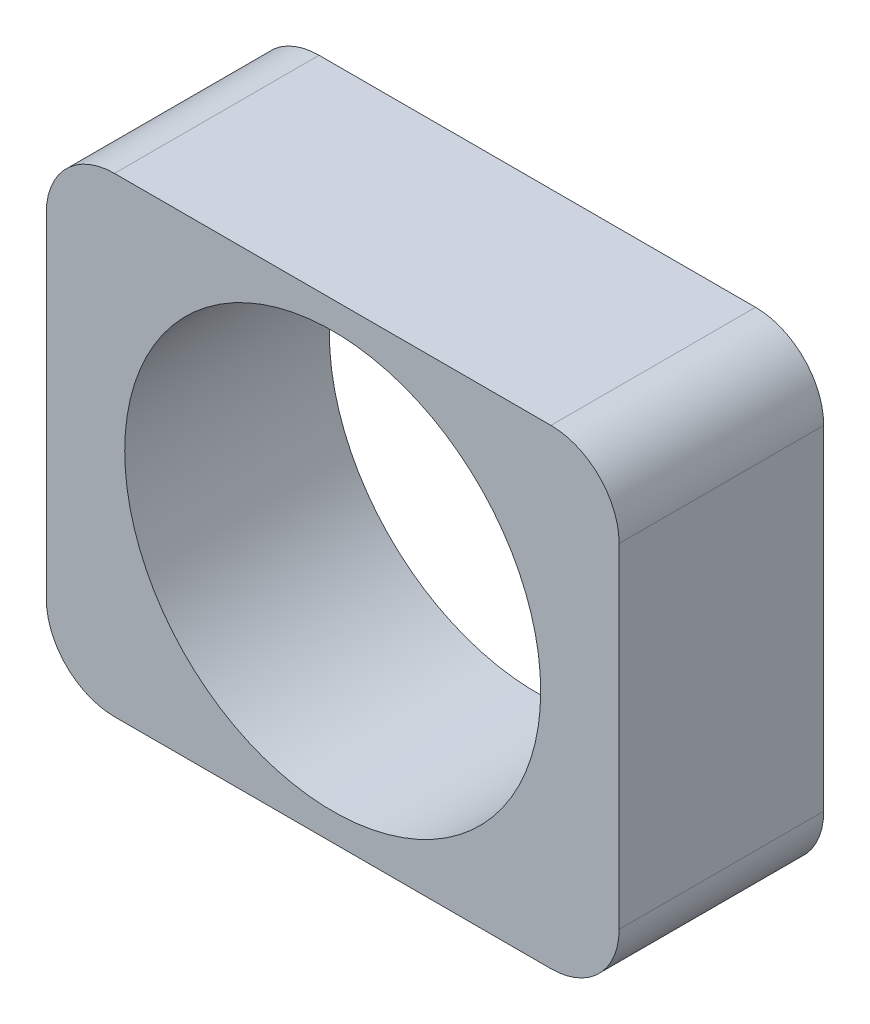
ISO-10303-21;
HEADER;
FILE_DESCRIPTION(('STEP AP214'),'2;1');
FILE_NAME('part.step','',(''),(''),'','','');
FILE_SCHEMA(('AUTOMOTIVE_DESIGN { 1 0 10303 214 1 1 1 1 }'));
ENDSEC;
DATA;
#1=APPLICATION_CONTEXT('core data for automotive mechanical design processes');
#2=APPLICATION_PROTOCOL_DEFINITION('international standard','automotive_design',2000,#1);
#3=PRODUCT_CONTEXT('',#1,'mechanical');
#4=PRODUCT('Part','Part','',(#3));
#5=PRODUCT_RELATED_PRODUCT_CATEGORY('part','',(#4));
#6=PRODUCT_DEFINITION_FORMATION('','',#4);
#7=PRODUCT_DEFINITION_CONTEXT('part definition',#1,'design');
#8=PRODUCT_DEFINITION('design','',#6,#7);
#9=PRODUCT_DEFINITION_SHAPE('','',#8);
#10=(LENGTH_UNIT() NAMED_UNIT(*) SI_UNIT(.MILLI.,.METRE.));
#11=(NAMED_UNIT(*) PLANE_ANGLE_UNIT() SI_UNIT($,.RADIAN.));
#12=(NAMED_UNIT(*) SI_UNIT($,.STERADIAN.) SOLID_ANGLE_UNIT());
#13=UNCERTAINTY_MEASURE_WITH_UNIT(LENGTH_MEASURE(1.E-05),#10,'distance_accuracy_value','');
#14=(GEOMETRIC_REPRESENTATION_CONTEXT(3) GLOBAL_UNCERTAINTY_ASSIGNED_CONTEXT((#13)) GLOBAL_UNIT_ASSIGNED_CONTEXT((#10,
#11,#12)) REPRESENTATION_CONTEXT('',''));
#15=CARTESIAN_POINT('',(0.,0.,0.));
#16=DIRECTION('',(0.,0.,1.));
#17=DIRECTION('',(1.,0.,0.));
#18=AXIS2_PLACEMENT_3D('',#15,#16,#17);
#19=CARTESIAN_POINT('',(8.4,6.9,6.));
#20=DIRECTION('',(-1.,0.,0.));
#21=DIRECTION('',(0.,-1.,0.));
#22=AXIS2_PLACEMENT_3D('',#19,#20,#21);
#23=PLANE('',#22);
#24=DIRECTION('',(0.,1.,0.));
#25=VECTOR('',#24,1.);
#26=CARTESIAN_POINT('',(8.4,6.9,6.));
#27=LINE('',#26,#25);
#28=CARTESIAN_POINT('',(8.4,-4.9,6.));
#29=VERTEX_POINT('',#28);
#30=CARTESIAN_POINT('',(8.4,4.9,6.));
#31=VERTEX_POINT('',#30);
#32=EDGE_CURVE('E119',#29,#31,#27,.T.);
#33=ORIENTED_EDGE('',*,*,#32,.F.);
#34=DIRECTION('',(0.,0.,-1.));
#35=VECTOR('',#34,1.);
#36=CARTESIAN_POINT('',(8.4,-4.9,6.));
#37=LINE('',#36,#35);
#38=CARTESIAN_POINT('',(8.4,-4.9,0.));
#39=VERTEX_POINT('',#38);
#40=EDGE_CURVE('E104',#29,#39,#37,.T.);
#41=ORIENTED_EDGE('',*,*,#40,.T.);
#42=DIRECTION('',(0.,1.,0.));
#43=VECTOR('',#42,1.);
#44=CARTESIAN_POINT('',(8.4,6.9,0.));
#45=LINE('',#44,#43);
#46=CARTESIAN_POINT('',(8.4,4.9,0.));
#47=VERTEX_POINT('',#46);
#48=EDGE_CURVE('E116',#39,#47,#45,.T.);
#49=ORIENTED_EDGE('',*,*,#48,.T.);
#50=DIRECTION('',(0.,0.,-1.));
#51=VECTOR('',#50,1.);
#52=CARTESIAN_POINT('',(8.4,4.9,6.));
#53=LINE('',#52,#51);
#54=EDGE_CURVE('E121',#47,#31,#53,.F.);
#55=ORIENTED_EDGE('',*,*,#54,.T.);
#56=EDGE_LOOP('',(#33,#41,#49,#55));
#57=FACE_BOUND('',#56,.T.);
#58=ADVANCED_FACE('F33',(#57),#23,.F.);
#59=CARTESIAN_POINT('',(-8.40000000000001,6.9,6.));
#60=DIRECTION('',(0.,-1.,0.));
#61=DIRECTION('',(0.,0.,-1.));
#62=AXIS2_PLACEMENT_3D('',#59,#60,#61);
#63=PLANE('',#62);
#64=DIRECTION('',(-1.,0.,0.));
#65=VECTOR('',#64,1.);
#66=CARTESIAN_POINT('',(-8.40000000000001,6.9,6.));
#67=LINE('',#66,#65);
#68=CARTESIAN_POINT('',(6.39999999999999,6.9,6.));
#69=VERTEX_POINT('',#68);
#70=CARTESIAN_POINT('',(-6.40000000000001,6.9,6.));
#71=VERTEX_POINT('',#70);
#72=EDGE_CURVE('E163',#69,#71,#67,.T.);
#73=ORIENTED_EDGE('',*,*,#72,.F.);
#74=DIRECTION('',(0.,0.,-1.));
#75=VECTOR('',#74,1.);
#76=CARTESIAN_POINT('',(6.39999999999999,6.9,6.));
#77=LINE('',#76,#75);
#78=CARTESIAN_POINT('',(6.39999999999999,6.9,0.));
#79=VERTEX_POINT('',#78);
#80=EDGE_CURVE('E11',#69,#79,#77,.T.);
#81=ORIENTED_EDGE('',*,*,#80,.T.);
#82=DIRECTION('',(-1.,0.,0.));
#83=VECTOR('',#82,1.);
#84=CARTESIAN_POINT('',(-8.40000000000001,6.9,0.));
#85=LINE('',#84,#83);
#86=CARTESIAN_POINT('',(-6.40000000000001,6.9,0.));
#87=VERTEX_POINT('',#86);
#88=EDGE_CURVE('E126',#79,#87,#85,.T.);
#89=ORIENTED_EDGE('',*,*,#88,.T.);
#90=DIRECTION('',(0.,0.,-1.));
#91=VECTOR('',#90,1.);
#92=CARTESIAN_POINT('',(-6.40000000000001,6.9,6.));
#93=LINE('',#92,#91);
#94=EDGE_CURVE('E41',#87,#71,#93,.F.);
#95=ORIENTED_EDGE('',*,*,#94,.T.);
#96=EDGE_LOOP('',(#73,#81,#89,#95));
#97=FACE_BOUND('',#96,.T.);
#98=ADVANCED_FACE('F162',(#97),#63,.F.);
#99=CARTESIAN_POINT('',(-8.40000000000001,6.9,6.));
#100=DIRECTION('',(1.,0.,0.));
#101=DIRECTION('',(0.,1.,0.));
#102=AXIS2_PLACEMENT_3D('',#99,#100,#101);
#103=PLANE('',#102);
#104=DIRECTION('',(0.,-1.,0.));
#105=VECTOR('',#104,1.);
#106=CARTESIAN_POINT('',(-8.40000000000001,6.9,0.));
#107=LINE('',#106,#105);
#108=CARTESIAN_POINT('',(-8.40000000000001,4.9,0.));
#109=VERTEX_POINT('',#108);
#110=CARTESIAN_POINT('',(-8.40000000000001,-4.9,0.));
#111=VERTEX_POINT('',#110);
#112=EDGE_CURVE('E130',#109,#111,#107,.T.);
#113=ORIENTED_EDGE('',*,*,#112,.T.);
#114=DIRECTION('',(0.,0.,-1.));
#115=VECTOR('',#114,1.);
#116=CARTESIAN_POINT('',(-8.40000000000001,-4.9,6.));
#117=LINE('',#116,#115);
#118=CARTESIAN_POINT('',(-8.40000000000001,-4.9,6.));
#119=VERTEX_POINT('',#118);
#120=EDGE_CURVE('E48',#111,#119,#117,.F.);
#121=ORIENTED_EDGE('',*,*,#120,.T.);
#122=DIRECTION('',(0.,-1.,0.));
#123=VECTOR('',#122,1.);
#124=CARTESIAN_POINT('',(-8.40000000000001,6.9,6.));
#125=LINE('',#124,#123);
#126=CARTESIAN_POINT('',(-8.40000000000001,4.9,6.));
#127=VERTEX_POINT('',#126);
#128=EDGE_CURVE('E169',#127,#119,#125,.T.);
#129=ORIENTED_EDGE('',*,*,#128,.F.);
#130=DIRECTION('',(0.,0.,-1.));
#131=VECTOR('',#130,1.);
#132=CARTESIAN_POINT('',(-8.40000000000001,4.9,6.));
#133=LINE('',#132,#131);
#134=EDGE_CURVE('E156',#127,#109,#133,.T.);
#135=ORIENTED_EDGE('',*,*,#134,.T.);
#136=EDGE_LOOP('',(#113,#121,#129,#135));
#137=FACE_BOUND('',#136,.T.);
#138=ADVANCED_FACE('F173',(#137),#103,.F.);
#139=CARTESIAN_POINT('',(-8.40000000000001,-6.9,6.));
#140=DIRECTION('',(0.,1.,0.));
#141=DIRECTION('',(0.,0.,1.));
#142=AXIS2_PLACEMENT_3D('',#139,#140,#141);
#143=PLANE('',#142);
#144=DIRECTION('',(1.,0.,0.));
#145=VECTOR('',#144,1.);
#146=CARTESIAN_POINT('',(-8.40000000000001,-6.9,0.));
#147=LINE('',#146,#145);
#148=CARTESIAN_POINT('',(-6.40000000000001,-6.9,0.));
#149=VERTEX_POINT('',#148);
#150=CARTESIAN_POINT('',(6.4,-6.9,0.));
#151=VERTEX_POINT('',#150);
#152=EDGE_CURVE('E140',#149,#151,#147,.T.);
#153=ORIENTED_EDGE('',*,*,#152,.T.);
#154=DIRECTION('',(0.,0.,-1.));
#155=VECTOR('',#154,1.);
#156=CARTESIAN_POINT('',(6.4,-6.9,6.));
#157=LINE('',#156,#155);
#158=CARTESIAN_POINT('',(6.4,-6.9,6.));
#159=VERTEX_POINT('',#158);
#160=EDGE_CURVE('E105',#151,#159,#157,.F.);
#161=ORIENTED_EDGE('',*,*,#160,.T.);
#162=DIRECTION('',(1.,0.,0.));
#163=VECTOR('',#162,1.);
#164=CARTESIAN_POINT('',(-8.40000000000001,-6.9,6.));
#165=LINE('',#164,#163);
#166=CARTESIAN_POINT('',(-6.40000000000001,-6.9,6.));
#167=VERTEX_POINT('',#166);
#168=EDGE_CURVE('E136',#167,#159,#165,.T.);
#169=ORIENTED_EDGE('',*,*,#168,.F.);
#170=DIRECTION('',(0.,0.,-1.));
#171=VECTOR('',#170,1.);
#172=CARTESIAN_POINT('',(-6.40000000000001,-6.9,6.));
#173=LINE('',#172,#171);
#174=EDGE_CURVE('E110',#167,#149,#173,.T.);
#175=ORIENTED_EDGE('',*,*,#174,.T.);
#176=EDGE_LOOP('',(#153,#161,#169,#175));
#177=FACE_BOUND('',#176,.T.);
#178=ADVANCED_FACE('F180',(#177),#143,.F.);
#179=CARTESIAN_POINT('',(0.,0.,6.));
#180=DIRECTION('',(0.,0.,1.));
#181=DIRECTION('',(1.,0.,0.));
#182=AXIS2_PLACEMENT_3D('',#179,#180,#181);
#183=PLANE('',#182);
#184=CARTESIAN_POINT('',(0.,0.,6.));
#185=DIRECTION('',(0.,0.,1.));
#186=DIRECTION('',(1.,0.,0.));
#187=AXIS2_PLACEMENT_3D('',#184,#185,#186);
#188=CIRCLE('',#187,6.1);
#189=CARTESIAN_POINT('',(6.1,0.,6.));
#190=VERTEX_POINT('',#189);
#191=EDGE_CURVE('E133',#190,#190,#188,.T.);
#192=ORIENTED_EDGE('',*,*,#191,.F.);
#193=EDGE_LOOP('',(#192));
#194=FACE_BOUND('',#193,.T.);
#195=ORIENTED_EDGE('',*,*,#168,.T.);
#196=CARTESIAN_POINT('',(6.4,-4.9,6.));
#197=DIRECTION('',(0.,0.,1.));
#198=DIRECTION('',(1.,0.,0.));
#199=AXIS2_PLACEMENT_3D('',#196,#197,#198);
#200=CIRCLE('',#199,2.);
#201=EDGE_CURVE('E154',#159,#29,#200,.T.);
#202=ORIENTED_EDGE('',*,*,#201,.T.);
#203=ORIENTED_EDGE('',*,*,#32,.T.);
#204=CARTESIAN_POINT('',(6.39999999999999,4.9,6.));
#205=DIRECTION('',(0.,0.,1.));
#206=DIRECTION('',(1.,0.,0.));
#207=AXIS2_PLACEMENT_3D('',#204,#205,#206);
#208=CIRCLE('',#207,2.);
#209=EDGE_CURVE('E150',#31,#69,#208,.T.);
#210=ORIENTED_EDGE('',*,*,#209,.T.);
#211=ORIENTED_EDGE('',*,*,#72,.T.);
#212=CARTESIAN_POINT('',(-6.40000000000001,4.9,6.));
#213=DIRECTION('',(0.,0.,1.));
#214=DIRECTION('',(1.,0.,0.));
#215=AXIS2_PLACEMENT_3D('',#212,#213,#214);
#216=CIRCLE('',#215,2.);
#217=EDGE_CURVE('E55',#71,#127,#216,.T.);
#218=ORIENTED_EDGE('',*,*,#217,.T.);
#219=ORIENTED_EDGE('',*,*,#128,.T.);
#220=CARTESIAN_POINT('',(-6.40000000000001,-4.9,6.));
#221=DIRECTION('',(0.,0.,1.));
#222=DIRECTION('',(1.,0.,0.));
#223=AXIS2_PLACEMENT_3D('',#220,#221,#222);
#224=CIRCLE('',#223,2.);
#225=EDGE_CURVE('E152',#119,#167,#224,.T.);
#226=ORIENTED_EDGE('',*,*,#225,.T.);
#227=EDGE_LOOP('',(#195,#202,#203,#210,#211,#218,#219,#226));
#228=FACE_BOUND('',#227,.T.);
#229=ADVANCED_FACE('F167',(#194,#228),#183,.T.);
#230=CARTESIAN_POINT('',(0.,0.,0.));
#231=DIRECTION('',(0.,0.,1.));
#232=DIRECTION('',(1.,0.,0.));
#233=AXIS2_PLACEMENT_3D('',#230,#231,#232);
#234=PLANE('',#233);
#235=CARTESIAN_POINT('',(0.,0.,0.));
#236=DIRECTION('',(0.,0.,1.));
#237=DIRECTION('',(1.,0.,0.));
#238=AXIS2_PLACEMENT_3D('',#235,#236,#237);
#239=CIRCLE('',#238,6.1);
#240=CARTESIAN_POINT('',(6.1,0.,0.));
#241=VERTEX_POINT('',#240);
#242=EDGE_CURVE('E127',#241,#241,#239,.F.);
#243=ORIENTED_EDGE('',*,*,#242,.F.);
#244=EDGE_LOOP('',(#243));
#245=FACE_BOUND('',#244,.T.);
#246=ORIENTED_EDGE('',*,*,#48,.F.);
#247=CARTESIAN_POINT('',(6.4,-4.9,0.));
#248=DIRECTION('',(0.,0.,1.));
#249=DIRECTION('',(1.,0.,0.));
#250=AXIS2_PLACEMENT_3D('',#247,#248,#249);
#251=CIRCLE('',#250,2.);
#252=EDGE_CURVE('E100',#39,#151,#251,.F.);
#253=ORIENTED_EDGE('',*,*,#252,.T.);
#254=ORIENTED_EDGE('',*,*,#152,.F.);
#255=CARTESIAN_POINT('',(-6.40000000000001,-4.9,0.));
#256=DIRECTION('',(0.,0.,1.));
#257=DIRECTION('',(1.,0.,0.));
#258=AXIS2_PLACEMENT_3D('',#255,#256,#257);
#259=CIRCLE('',#258,2.);
#260=EDGE_CURVE('E111',#149,#111,#259,.F.);
#261=ORIENTED_EDGE('',*,*,#260,.T.);
#262=ORIENTED_EDGE('',*,*,#112,.F.);
#263=CARTESIAN_POINT('',(-6.40000000000001,4.9,0.));
#264=DIRECTION('',(0.,0.,1.));
#265=DIRECTION('',(1.,0.,0.));
#266=AXIS2_PLACEMENT_3D('',#263,#264,#265);
#267=CIRCLE('',#266,2.);
#268=EDGE_CURVE('E120',#109,#87,#267,.F.);
#269=ORIENTED_EDGE('',*,*,#268,.T.);
#270=ORIENTED_EDGE('',*,*,#88,.F.);
#271=CARTESIAN_POINT('',(6.39999999999999,4.9,0.));
#272=DIRECTION('',(0.,0.,1.));
#273=DIRECTION('',(1.,0.,0.));
#274=AXIS2_PLACEMENT_3D('',#271,#272,#273);
#275=CIRCLE('',#274,2.);
#276=EDGE_CURVE('E125',#79,#47,#275,.F.);
#277=ORIENTED_EDGE('',*,*,#276,.T.);
#278=EDGE_LOOP('',(#246,#253,#254,#261,#262,#269,#270,#277));
#279=FACE_BOUND('',#278,.T.);
#280=ADVANCED_FACE('F123',(#245,#279),#234,.F.);
#281=CARTESIAN_POINT('',(0.,0.,-0.00100000000000013));
#282=DIRECTION('',(0.,0.,1.));
#283=DIRECTION('',(1.,0.,0.));
#284=AXIS2_PLACEMENT_3D('',#281,#282,#283);
#285=CYLINDRICAL_SURFACE('',#284,6.1);
#286=CARTESIAN_POINT('',(6.1,0.,6.));
#287=CARTESIAN_POINT('',(6.1,0.,5.9375));
#288=CARTESIAN_POINT('',(6.1,0.,5.875));
#289=CARTESIAN_POINT('',(6.1,0.,5.75));
#290=CARTESIAN_POINT('',(6.1,0.,5.6875));
#291=CARTESIAN_POINT('',(6.1,0.,5.5625));
#292=CARTESIAN_POINT('',(6.1,0.,5.5));
#293=CARTESIAN_POINT('',(6.1,0.,5.375));
#294=CARTESIAN_POINT('',(6.1,0.,5.3125));
#295=CARTESIAN_POINT('',(6.1,0.,5.1875));
#296=CARTESIAN_POINT('',(6.1,0.,5.125));
#297=CARTESIAN_POINT('',(6.1,0.,5.));
#298=CARTESIAN_POINT('',(6.1,0.,4.9375));
#299=CARTESIAN_POINT('',(6.1,0.,4.8125));
#300=CARTESIAN_POINT('',(6.1,0.,4.75));
#301=CARTESIAN_POINT('',(6.1,0.,4.625));
#302=CARTESIAN_POINT('',(6.1,0.,4.5625));
#303=CARTESIAN_POINT('',(6.1,0.,4.4375));
#304=CARTESIAN_POINT('',(6.1,0.,4.375));
#305=CARTESIAN_POINT('',(6.1,0.,4.25));
#306=CARTESIAN_POINT('',(6.1,0.,4.1875));
#307=CARTESIAN_POINT('',(6.1,0.,4.0625));
#308=CARTESIAN_POINT('',(6.1,0.,4.));
#309=CARTESIAN_POINT('',(6.1,0.,3.875));
#310=CARTESIAN_POINT('',(6.1,0.,3.8125));
#311=CARTESIAN_POINT('',(6.1,0.,3.6875));
#312=CARTESIAN_POINT('',(6.1,0.,3.625));
#313=CARTESIAN_POINT('',(6.1,0.,3.5));
#314=CARTESIAN_POINT('',(6.1,0.,3.4375));
#315=CARTESIAN_POINT('',(6.1,0.,3.3125));
#316=CARTESIAN_POINT('',(6.1,0.,3.25));
#317=CARTESIAN_POINT('',(6.1,0.,3.125));
#318=CARTESIAN_POINT('',(6.1,0.,3.0625));
#319=CARTESIAN_POINT('',(6.1,0.,2.9375));
#320=CARTESIAN_POINT('',(6.1,0.,2.875));
#321=CARTESIAN_POINT('',(6.1,0.,2.75));
#322=CARTESIAN_POINT('',(6.1,0.,2.6875));
#323=CARTESIAN_POINT('',(6.1,0.,2.5625));
#324=CARTESIAN_POINT('',(6.1,0.,2.5));
#325=CARTESIAN_POINT('',(6.1,0.,2.375));
#326=CARTESIAN_POINT('',(6.1,0.,2.3125));
#327=CARTESIAN_POINT('',(6.1,0.,2.1875));
#328=CARTESIAN_POINT('',(6.1,0.,2.125));
#329=CARTESIAN_POINT('',(6.1,0.,2.));
#330=CARTESIAN_POINT('',(6.1,0.,1.9375));
#331=CARTESIAN_POINT('',(6.1,0.,1.8125));
#332=CARTESIAN_POINT('',(6.1,0.,1.75));
#333=CARTESIAN_POINT('',(6.1,0.,1.625));
#334=CARTESIAN_POINT('',(6.1,0.,1.5625));
#335=CARTESIAN_POINT('',(6.1,0.,1.4375));
#336=CARTESIAN_POINT('',(6.1,0.,1.375));
#337=CARTESIAN_POINT('',(6.1,0.,1.25));
#338=CARTESIAN_POINT('',(6.1,0.,1.1875));
#339=CARTESIAN_POINT('',(6.1,0.,1.0625));
#340=CARTESIAN_POINT('',(6.1,0.,1.));
#341=CARTESIAN_POINT('',(6.1,0.,0.875));
#342=CARTESIAN_POINT('',(6.1,0.,0.8125));
#343=CARTESIAN_POINT('',(6.1,0.,0.6875));
#344=CARTESIAN_POINT('',(6.1,0.,0.625));
#345=CARTESIAN_POINT('',(6.1,0.,0.5));
#346=CARTESIAN_POINT('',(6.1,0.,0.4375));
#347=CARTESIAN_POINT('',(6.1,0.,0.3125));
#348=CARTESIAN_POINT('',(6.1,0.,0.25));
#349=CARTESIAN_POINT('',(6.1,0.,0.125));
#350=CARTESIAN_POINT('',(6.1,0.,0.0625000000000001));
#351=CARTESIAN_POINT('',(6.1,0.,0.));
#352=B_SPLINE_CURVE_WITH_KNOTS('',3,(#286,#287,#288,#289,#290,#291,#292,#293,#294,#295,#296,
#297,#298,#299,#300,#301,#302,#303,#304,#305,#306,#307,#308,#309,#310,#311,#312,#313,#314,#315,
#316,#317,#318,#319,#320,#321,#322,#323,#324,#325,#326,#327,#328,#329,#330,#331,#332,#333,#334,
#335,#336,#337,#338,#339,#340,#341,#342,#343,#344,#345,#346,#347,#348,#349,#350,#351),
.UNSPECIFIED.,.F.,.F.,(4,2,2,2,2,2,2,2,2,2,2,2,2,2,2,2,2,2,2,2,2,2,2,2,2,2,2,2,2,2,2,2,4),(0.,
0.1875,0.375,0.5625,0.75,0.9375,1.125,1.3125,1.5,1.6875,1.875,2.0625,2.25,2.4375,2.625,2.8125,
3.,3.1875,3.375,3.5625,3.75,3.9375,4.125,4.3125,4.5,4.6875,4.875,5.0625,5.25,5.4375,5.625,
5.8125,6.),.UNSPECIFIED.);
#353=EDGE_CURVE('BSEAM186',#190,#241,#352,.T.);
#354=ORIENTED_EDGE('',*,*,#191,.T.);
#355=ORIENTED_EDGE('',*,*,#242,.T.);
#356=ORIENTED_EDGE('',*,*,#353,.T.);
#357=ORIENTED_EDGE('',*,*,#353,.F.);
#358=EDGE_LOOP('',(#354,#356,#355,#357));
#359=FACE_BOUND('',#358,.T.);
#360=ADVANCED_FACE('F186',(#359),#285,.F.);
#361=CARTESIAN_POINT('',(6.4,-4.9,6.));
#362=DIRECTION('',(0.,0.,-1.));
#363=DIRECTION('',(-1.,0.,0.));
#364=AXIS2_PLACEMENT_3D('',#361,#362,#363);
#365=CYLINDRICAL_SURFACE('',#364,2.);
#366=ORIENTED_EDGE('',*,*,#201,.F.);
#367=ORIENTED_EDGE('',*,*,#160,.F.);
#368=ORIENTED_EDGE('',*,*,#252,.F.);
#369=ORIENTED_EDGE('',*,*,#40,.F.);
#370=EDGE_LOOP('',(#366,#367,#368,#369));
#371=FACE_BOUND('',#370,.T.);
#372=ADVANCED_FACE('F103',(#371),#365,.T.);
#373=CARTESIAN_POINT('',(-6.40000000000001,-4.9,6.));
#374=DIRECTION('',(0.,0.,-1.));
#375=DIRECTION('',(-1.,0.,0.));
#376=AXIS2_PLACEMENT_3D('',#373,#374,#375);
#377=CYLINDRICAL_SURFACE('',#376,2.);
#378=ORIENTED_EDGE('',*,*,#225,.F.);
#379=ORIENTED_EDGE('',*,*,#120,.F.);
#380=ORIENTED_EDGE('',*,*,#260,.F.);
#381=ORIENTED_EDGE('',*,*,#174,.F.);
#382=EDGE_LOOP('',(#378,#379,#380,#381));
#383=FACE_BOUND('',#382,.T.);
#384=ADVANCED_FACE('F177',(#383),#377,.T.);
#385=CARTESIAN_POINT('',(6.39999999999999,4.9,6.));
#386=DIRECTION('',(0.,0.,-1.));
#387=DIRECTION('',(-1.,0.,0.));
#388=AXIS2_PLACEMENT_3D('',#385,#386,#387);
#389=CYLINDRICAL_SURFACE('',#388,2.);
#390=ORIENTED_EDGE('',*,*,#209,.F.);
#391=ORIENTED_EDGE('',*,*,#54,.F.);
#392=ORIENTED_EDGE('',*,*,#276,.F.);
#393=ORIENTED_EDGE('',*,*,#80,.F.);
#394=EDGE_LOOP('',(#390,#391,#392,#393));
#395=FACE_BOUND('',#394,.T.);
#396=ADVANCED_FACE('F210',(#395),#389,.T.);
#397=CARTESIAN_POINT('',(-6.40000000000001,4.9,6.));
#398=DIRECTION('',(0.,0.,-1.));
#399=DIRECTION('',(-1.,0.,0.));
#400=AXIS2_PLACEMENT_3D('',#397,#398,#399);
#401=CYLINDRICAL_SURFACE('',#400,2.);
#402=ORIENTED_EDGE('',*,*,#217,.F.);
#403=ORIENTED_EDGE('',*,*,#94,.F.);
#404=ORIENTED_EDGE('',*,*,#268,.F.);
#405=ORIENTED_EDGE('',*,*,#134,.F.);
#406=EDGE_LOOP('',(#402,#403,#404,#405));
#407=FACE_BOUND('',#406,.T.);
#408=ADVANCED_FACE('F35',(#407),#401,.T.);
#409=CLOSED_SHELL('',(#58,#98,#138,#178,#229,#280,#360,#372,#384,#396,#408));
#410=MANIFOLD_SOLID_BREP('B2',#409);
#411=ADVANCED_BREP_SHAPE_REPRESENTATION('',(#18,#410),#14);
#412=SHAPE_DEFINITION_REPRESENTATION(#9,#411);
ENDSEC;
END-ISO-10303-21;
